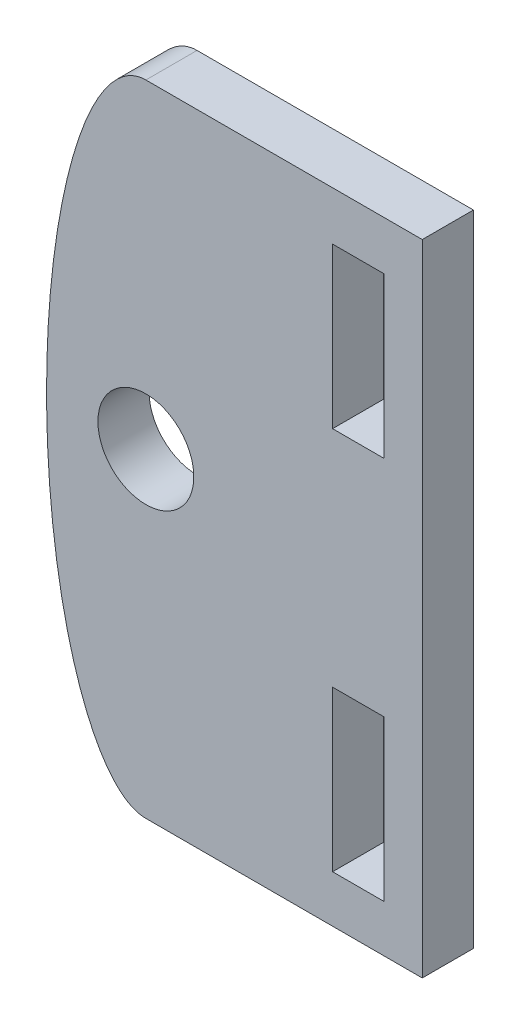
ISO-10303-21;
HEADER;
FILE_DESCRIPTION(('STEP AP214'),'2;1');
FILE_NAME('part.step','',(''),(''),'','','');
FILE_SCHEMA(('AUTOMOTIVE_DESIGN { 1 0 10303 214 1 1 1 1 }'));
ENDSEC;
DATA;
#1=APPLICATION_CONTEXT('core data for automotive mechanical design processes');
#2=APPLICATION_PROTOCOL_DEFINITION('international standard','automotive_design',2000,#1);
#3=PRODUCT_CONTEXT('',#1,'mechanical');
#4=PRODUCT('Part','Part','',(#3));
#5=PRODUCT_RELATED_PRODUCT_CATEGORY('part','',(#4));
#6=PRODUCT_DEFINITION_FORMATION('','',#4);
#7=PRODUCT_DEFINITION_CONTEXT('part definition',#1,'design');
#8=PRODUCT_DEFINITION('design','',#6,#7);
#9=PRODUCT_DEFINITION_SHAPE('','',#8);
#10=(LENGTH_UNIT() NAMED_UNIT(*) SI_UNIT(.MILLI.,.METRE.));
#11=(NAMED_UNIT(*) PLANE_ANGLE_UNIT() SI_UNIT($,.RADIAN.));
#12=(NAMED_UNIT(*) SI_UNIT($,.STERADIAN.) SOLID_ANGLE_UNIT());
#13=UNCERTAINTY_MEASURE_WITH_UNIT(LENGTH_MEASURE(1.E-05),#10,'distance_accuracy_value','');
#14=(GEOMETRIC_REPRESENTATION_CONTEXT(3) GLOBAL_UNCERTAINTY_ASSIGNED_CONTEXT((#13)) GLOBAL_UNIT_ASSIGNED_CONTEXT((#10,
#11,#12)) REPRESENTATION_CONTEXT('',''));
#15=CARTESIAN_POINT('',(0.,0.,0.));
#16=DIRECTION('',(0.,0.,1.));
#17=DIRECTION('',(1.,0.,0.));
#18=AXIS2_PLACEMENT_3D('',#15,#16,#17);
#19=CARTESIAN_POINT('',(149.971351089703,149.795415528333,12.4625));
#20=DIRECTION('',(0.,0.,-1.));
#21=DIRECTION('',(-1.,0.,0.));
#22=AXIS2_PLACEMENT_3D('',#19,#20,#21);
#23=PLANE('',#22);
#24=CARTESIAN_POINT('',(146.460498120251,149.795415528333,12.4625));
#25=DIRECTION('',(0.,0.,1.));
#26=DIRECTION('',(1.,0.,0.));
#27=AXIS2_PLACEMENT_3D('',#24,#25,#26);
#28=CIRCLE('',#27,1.5);
#29=CARTESIAN_POINT('',(144.960498120251,149.795415528333,12.4625));
#30=VERTEX_POINT('',#29);
#31=EDGE_CURVE('E133',#30,#30,#28,.T.);
#32=ORIENTED_EDGE('',*,*,#31,.T.);
#33=EDGE_LOOP('',(#32));
#34=FACE_BOUND('',#33,.T.);
#35=DIRECTION('',(0.,1.,0.));
#36=VECTOR('',#35,1.);
#37=CARTESIAN_POINT('',(153.909014966795,145.532915528333,12.4625));
#38=LINE('',#37,#36);
#39=CARTESIAN_POINT('',(153.909014966795,141.270415528333,12.4625));
#40=VERTEX_POINT('',#39);
#41=CARTESIAN_POINT('',(153.909014966795,146.270415528333,12.4625));
#42=VERTEX_POINT('',#41);
#43=EDGE_CURVE('E159',#40,#42,#38,.T.);
#44=ORIENTED_EDGE('',*,*,#43,.T.);
#45=DIRECTION('',(-1.,0.,0.));
#46=VECTOR('',#45,1.);
#47=CARTESIAN_POINT('',(151.940183028249,146.270415528333,12.4625));
#48=LINE('',#47,#46);
#49=CARTESIAN_POINT('',(152.299014966795,146.270415528333,12.4625));
#50=VERTEX_POINT('',#49);
#51=EDGE_CURVE('E167',#42,#50,#48,.T.);
#52=ORIENTED_EDGE('',*,*,#51,.T.);
#53=DIRECTION('',(0.,-1.,0.));
#54=VECTOR('',#53,1.);
#55=CARTESIAN_POINT('',(152.299014966795,148.032915528333,12.4625));
#56=LINE('',#55,#54);
#57=CARTESIAN_POINT('',(152.299014966795,141.270415528333,12.4625));
#58=VERTEX_POINT('',#57);
#59=EDGE_CURVE('E183',#50,#58,#56,.T.);
#60=ORIENTED_EDGE('',*,*,#59,.T.);
#61=DIRECTION('',(1.,0.,0.));
#62=VECTOR('',#61,1.);
#63=CARTESIAN_POINT('',(151.135183028249,141.270415528333,12.4625));
#64=LINE('',#63,#62);
#65=EDGE_CURVE('E197',#58,#40,#64,.T.);
#66=ORIENTED_EDGE('',*,*,#65,.T.);
#67=EDGE_LOOP('',(#44,#52,#60,#66));
#68=FACE_BOUND('',#67,.T.);
#69=DIRECTION('',(0.,1.,0.));
#70=VECTOR('',#69,1.);
#71=CARTESIAN_POINT('',(153.909014966795,151.532915528333,12.4625));
#72=LINE('',#71,#70);
#73=CARTESIAN_POINT('',(153.909014966795,153.270415528333,12.4625));
#74=VERTEX_POINT('',#73);
#75=CARTESIAN_POINT('',(153.909014966795,158.270415528333,12.4625));
#76=VERTEX_POINT('',#75);
#77=EDGE_CURVE('E250',#74,#76,#72,.T.);
#78=ORIENTED_EDGE('',*,*,#77,.T.);
#79=DIRECTION('',(-1.,0.,0.));
#80=VECTOR('',#79,1.);
#81=CARTESIAN_POINT('',(151.940183028249,158.270415528333,12.4625));
#82=LINE('',#81,#80);
#83=CARTESIAN_POINT('',(152.299014966795,158.270415528333,12.4625));
#84=VERTEX_POINT('',#83);
#85=EDGE_CURVE('E229',#76,#84,#82,.T.);
#86=ORIENTED_EDGE('',*,*,#85,.T.);
#87=DIRECTION('',(0.,-1.,0.));
#88=VECTOR('',#87,1.);
#89=CARTESIAN_POINT('',(152.299014966795,154.032915528333,12.4625));
#90=LINE('',#89,#88);
#91=CARTESIAN_POINT('',(152.299014966795,153.270415528333,12.4625));
#92=VERTEX_POINT('',#91);
#93=EDGE_CURVE('E211',#84,#92,#90,.T.);
#94=ORIENTED_EDGE('',*,*,#93,.T.);
#95=DIRECTION('',(1.,0.,0.));
#96=VECTOR('',#95,1.);
#97=CARTESIAN_POINT('',(151.135183028249,153.270415528333,12.4625));
#98=LINE('',#97,#96);
#99=EDGE_CURVE('E178',#92,#74,#98,.T.);
#100=ORIENTED_EDGE('',*,*,#99,.T.);
#101=EDGE_LOOP('',(#78,#86,#94,#100));
#102=FACE_BOUND('',#101,.T.);
#103=DIRECTION('',(-1.,0.,0.));
#104=VECTOR('',#103,1.);
#105=CARTESIAN_POINT('',(146.460498120251,159.795415528333,12.4625));
#106=LINE('',#105,#104);
#107=CARTESIAN_POINT('',(155.104014966795,159.795415528333,12.4625));
#108=VERTEX_POINT('',#107);
#109=CARTESIAN_POINT('',(146.460498120251,159.795415528333,12.4625));
#110=VERTEX_POINT('',#109);
#111=EDGE_CURVE('E132',#108,#110,#106,.T.);
#112=ORIENTED_EDGE('',*,*,#111,.F.);
#113=DIRECTION('',(0.,1.,0.));
#114=VECTOR('',#113,1.);
#115=CARTESIAN_POINT('',(155.104014966795,159.795415528333,12.4625));
#116=LINE('',#115,#114);
#117=CARTESIAN_POINT('',(155.104014966795,139.795415528333,12.4625));
#118=VERTEX_POINT('',#117);
#119=EDGE_CURVE('E26',#118,#108,#116,.T.);
#120=ORIENTED_EDGE('',*,*,#119,.F.);
#121=DIRECTION('',(1.,0.,0.));
#122=VECTOR('',#121,1.);
#123=CARTESIAN_POINT('',(155.104014966795,139.795415528333,12.4625));
#124=LINE('',#123,#122);
#125=CARTESIAN_POINT('',(146.460498120251,139.795415528333,12.4625));
#126=VERTEX_POINT('',#125);
#127=EDGE_CURVE('E173',#126,#118,#124,.T.);
#128=ORIENTED_EDGE('',*,*,#127,.F.);
#129=CARTESIAN_POINT('',(146.460498120251,149.795415528333,12.4625));
#130=DIRECTION('',(0.,0.,1.));
#131=DIRECTION('',(0.,1.,0.));
#132=AXIS2_PLACEMENT_3D('',#129,#130,#131);
#133=ELLIPSE('',#132,10.,3.10673340497909);
#134=EDGE_CURVE('E149',#110,#126,#133,.T.);
#135=ORIENTED_EDGE('',*,*,#134,.F.);
#136=EDGE_LOOP('',(#112,#120,#128,#135));
#137=FACE_BOUND('',#136,.T.);
#138=ADVANCED_FACE('F16',(#34,#68,#102,#137),#23,.T.);
#139=CARTESIAN_POINT('',(149.971351089703,149.795415528333,14.0625));
#140=DIRECTION('',(0.,0.,-1.));
#141=DIRECTION('',(-1.,0.,0.));
#142=AXIS2_PLACEMENT_3D('',#139,#140,#141);
#143=PLANE('',#142);
#144=CARTESIAN_POINT('',(146.460498120251,149.795415528333,14.0625));
#145=DIRECTION('',(0.,0.,-1.));
#146=DIRECTION('',(1.,0.,0.));
#147=AXIS2_PLACEMENT_3D('',#144,#145,#146);
#148=CIRCLE('',#147,1.5);
#149=CARTESIAN_POINT('',(144.960498120251,149.795415528333,14.0625));
#150=VERTEX_POINT('',#149);
#151=EDGE_CURVE('E127',#150,#150,#148,.T.);
#152=ORIENTED_EDGE('',*,*,#151,.T.);
#153=EDGE_LOOP('',(#152));
#154=FACE_BOUND('',#153,.T.);
#155=DIRECTION('',(0.,-1.,0.));
#156=VECTOR('',#155,1.);
#157=CARTESIAN_POINT('',(153.909014966795,145.532915528333,14.0625));
#158=LINE('',#157,#156);
#159=CARTESIAN_POINT('',(153.909014966795,146.270415528333,14.0625));
#160=VERTEX_POINT('',#159);
#161=CARTESIAN_POINT('',(153.909014966795,141.270415528333,14.0625));
#162=VERTEX_POINT('',#161);
#163=EDGE_CURVE('E158',#160,#162,#158,.T.);
#164=ORIENTED_EDGE('',*,*,#163,.T.);
#165=DIRECTION('',(-1.,0.,0.));
#166=VECTOR('',#165,1.);
#167=CARTESIAN_POINT('',(151.135183028249,141.270415528333,14.0625));
#168=LINE('',#167,#166);
#169=CARTESIAN_POINT('',(152.299014966795,141.270415528333,14.0625));
#170=VERTEX_POINT('',#169);
#171=EDGE_CURVE('E143',#162,#170,#168,.T.);
#172=ORIENTED_EDGE('',*,*,#171,.T.);
#173=DIRECTION('',(0.,1.,0.));
#174=VECTOR('',#173,1.);
#175=CARTESIAN_POINT('',(152.299014966795,148.032915528333,14.0625));
#176=LINE('',#175,#174);
#177=CARTESIAN_POINT('',(152.299014966795,146.270415528333,14.0625));
#178=VERTEX_POINT('',#177);
#179=EDGE_CURVE('E187',#170,#178,#176,.T.);
#180=ORIENTED_EDGE('',*,*,#179,.T.);
#181=DIRECTION('',(1.,0.,0.));
#182=VECTOR('',#181,1.);
#183=CARTESIAN_POINT('',(151.940183028249,146.270415528333,14.0625));
#184=LINE('',#183,#182);
#185=EDGE_CURVE('E164',#178,#160,#184,.T.);
#186=ORIENTED_EDGE('',*,*,#185,.T.);
#187=EDGE_LOOP('',(#164,#172,#180,#186));
#188=FACE_BOUND('',#187,.T.);
#189=DIRECTION('',(0.,-1.,0.));
#190=VECTOR('',#189,1.);
#191=CARTESIAN_POINT('',(153.909014966795,151.532915528333,14.0625));
#192=LINE('',#191,#190);
#193=CARTESIAN_POINT('',(153.909014966795,158.270415528333,14.0625));
#194=VERTEX_POINT('',#193);
#195=CARTESIAN_POINT('',(153.909014966795,153.270415528333,14.0625));
#196=VERTEX_POINT('',#195);
#197=EDGE_CURVE('E191',#194,#196,#192,.T.);
#198=ORIENTED_EDGE('',*,*,#197,.T.);
#199=DIRECTION('',(-1.,0.,0.));
#200=VECTOR('',#199,1.);
#201=CARTESIAN_POINT('',(151.135183028249,153.270415528333,14.0625));
#202=LINE('',#201,#200);
#203=CARTESIAN_POINT('',(152.299014966795,153.270415528333,14.0625));
#204=VERTEX_POINT('',#203);
#205=EDGE_CURVE('E182',#196,#204,#202,.T.);
#206=ORIENTED_EDGE('',*,*,#205,.T.);
#207=DIRECTION('',(0.,1.,0.));
#208=VECTOR('',#207,1.);
#209=CARTESIAN_POINT('',(152.299014966795,154.032915528333,14.0625));
#210=LINE('',#209,#208);
#211=CARTESIAN_POINT('',(152.299014966795,158.270415528333,14.0625));
#212=VERTEX_POINT('',#211);
#213=EDGE_CURVE('E179',#204,#212,#210,.T.);
#214=ORIENTED_EDGE('',*,*,#213,.T.);
#215=DIRECTION('',(1.,0.,0.));
#216=VECTOR('',#215,1.);
#217=CARTESIAN_POINT('',(151.940183028249,158.270415528333,14.0625));
#218=LINE('',#217,#216);
#219=EDGE_CURVE('E212',#212,#194,#218,.T.);
#220=ORIENTED_EDGE('',*,*,#219,.T.);
#221=EDGE_LOOP('',(#198,#206,#214,#220));
#222=FACE_BOUND('',#221,.T.);
#223=DIRECTION('',(0.,-1.,0.));
#224=VECTOR('',#223,1.);
#225=CARTESIAN_POINT('',(155.104014966795,159.795415528333,14.0625));
#226=LINE('',#225,#224);
#227=CARTESIAN_POINT('',(155.104014966795,159.795415528333,14.0625));
#228=VERTEX_POINT('',#227);
#229=CARTESIAN_POINT('',(155.104014966795,139.795415528333,14.0625));
#230=VERTEX_POINT('',#229);
#231=EDGE_CURVE('E10',#228,#230,#226,.T.);
#232=ORIENTED_EDGE('',*,*,#231,.F.);
#233=DIRECTION('',(1.,0.,0.));
#234=VECTOR('',#233,1.);
#235=CARTESIAN_POINT('',(146.460498120251,159.795415528333,14.0625));
#236=LINE('',#235,#234);
#237=CARTESIAN_POINT('',(146.460498120251,159.795415528333,14.0625));
#238=VERTEX_POINT('',#237);
#239=EDGE_CURVE('E163',#238,#228,#236,.T.);
#240=ORIENTED_EDGE('',*,*,#239,.F.);
#241=CARTESIAN_POINT('',(146.460498120251,149.795415528333,14.0625));
#242=DIRECTION('',(0.,0.,-1.));
#243=DIRECTION('',(0.,1.,0.));
#244=AXIS2_PLACEMENT_3D('',#241,#242,#243);
#245=ELLIPSE('',#244,10.,3.10673340497909);
#246=CARTESIAN_POINT('',(146.460498120251,139.795415528333,14.0625));
#247=VERTEX_POINT('',#246);
#248=EDGE_CURVE('E169',#247,#238,#245,.T.);
#249=ORIENTED_EDGE('',*,*,#248,.F.);
#250=DIRECTION('',(-1.,0.,0.));
#251=VECTOR('',#250,1.);
#252=CARTESIAN_POINT('',(155.104014966795,139.795415528333,14.0625));
#253=LINE('',#252,#251);
#254=EDGE_CURVE('E190',#230,#247,#253,.T.);
#255=ORIENTED_EDGE('',*,*,#254,.F.);
#256=EDGE_LOOP('',(#232,#240,#249,#255));
#257=FACE_BOUND('',#256,.T.);
#258=ADVANCED_FACE('F128',(#154,#188,#222,#257),#143,.F.);
#259=CARTESIAN_POINT('',(155.104014966795,139.795415528333,14.0625));
#260=DIRECTION('',(1.,0.,0.));
#261=DIRECTION('',(0.,0.,-1.));
#262=AXIS2_PLACEMENT_3D('',#259,#260,#261);
#263=PLANE('',#262);
#264=ORIENTED_EDGE('',*,*,#119,.T.);
#265=DIRECTION('',(0.,0.,-1.));
#266=VECTOR('',#265,1.);
#267=CARTESIAN_POINT('',(155.104014966795,159.795415528333,14.0625));
#268=LINE('',#267,#266);
#269=EDGE_CURVE('E153',#228,#108,#268,.T.);
#270=ORIENTED_EDGE('',*,*,#269,.F.);
#271=ORIENTED_EDGE('',*,*,#231,.T.);
#272=DIRECTION('',(0.,0.,-1.));
#273=VECTOR('',#272,1.);
#274=CARTESIAN_POINT('',(155.104014966795,139.795415528333,14.0625));
#275=LINE('',#274,#273);
#276=EDGE_CURVE('E216',#230,#118,#275,.T.);
#277=ORIENTED_EDGE('',*,*,#276,.T.);
#278=EDGE_LOOP('',(#264,#270,#271,#277));
#279=FACE_BOUND('',#278,.T.);
#280=ADVANCED_FACE('F356',(#279),#263,.T.);
#281=CARTESIAN_POINT('',(146.460498120251,139.795415528333,14.0625));
#282=DIRECTION('',(0.,-1.,0.));
#283=DIRECTION('',(0.,0.,1.));
#284=AXIS2_PLACEMENT_3D('',#281,#282,#283);
#285=PLANE('',#284);
#286=ORIENTED_EDGE('',*,*,#127,.T.);
#287=ORIENTED_EDGE('',*,*,#276,.F.);
#288=ORIENTED_EDGE('',*,*,#254,.T.);
#289=DIRECTION('',(0.,0.,-1.));
#290=VECTOR('',#289,1.);
#291=CARTESIAN_POINT('',(146.460498120251,139.795415528333,14.0625));
#292=LINE('',#291,#290);
#293=EDGE_CURVE('E146',#247,#126,#292,.T.);
#294=ORIENTED_EDGE('',*,*,#293,.T.);
#295=EDGE_LOOP('',(#286,#287,#288,#294));
#296=FACE_BOUND('',#295,.T.);
#297=ADVANCED_FACE('F567',(#296),#285,.T.);
#298=CARTESIAN_POINT('',(146.460498120251,139.795415528333,14.0625));
#299=CARTESIAN_POINT('',(143.353764715272,139.795415528333,14.0625));
#300=CARTESIAN_POINT('',(143.353764715272,149.795415528333,14.0625));
#301=CARTESIAN_POINT('',(143.353764715272,159.795415528333,14.0625));
#302=CARTESIAN_POINT('',(146.460498120251,159.795415528333,14.0625));
#303=CARTESIAN_POINT('',(146.460498120251,139.795415528333,12.4625));
#304=CARTESIAN_POINT('',(143.353764715272,139.795415528333,12.4625));
#305=CARTESIAN_POINT('',(143.353764715272,149.795415528333,12.4625));
#306=CARTESIAN_POINT('',(143.353764715272,159.795415528333,12.4625));
#307=CARTESIAN_POINT('',(146.460498120251,159.795415528333,12.4625));
#308=(BOUNDED_SURFACE() B_SPLINE_SURFACE(1,2,((#298,#299,#300,#301,#302),(#303,#304,#305,#306,
#307)),.UNSPECIFIED.,.F.,.F.,.F.) B_SPLINE_SURFACE_WITH_KNOTS((2,2),(3,2,3),(0.,0.16),
(-3.1415926535898,-1.5707963267949,0.),
.UNSPECIFIED.) GEOMETRIC_REPRESENTATION_ITEM() RATIONAL_B_SPLINE_SURFACE(((1.,0.707106781186545,
1.,0.707106781186545,1.),(1.,0.707106781186545,1.,0.707106781186545,1.))) REPRESENTATION_ITEM('') SURFACE());
#309=DIRECTION('',(0.,0.,-1.));
#310=VECTOR('',#309,1.);
#311=CARTESIAN_POINT('',(146.460498120251,159.795415528333,14.0625));
#312=LINE('',#311,#310);
#313=EDGE_CURVE('E141',#238,#110,#312,.T.);
#314=ORIENTED_EDGE('',*,*,#134,.T.);
#315=ORIENTED_EDGE('',*,*,#293,.F.);
#316=ORIENTED_EDGE('',*,*,#248,.T.);
#317=ORIENTED_EDGE('',*,*,#313,.T.);
#318=EDGE_LOOP('',(#314,#315,#316,#317));
#319=FACE_BOUND('',#318,.T.);
#320=ADVANCED_FACE('F558',(#319),#308,.F.);
#321=CARTESIAN_POINT('',(155.104014966795,159.795415528333,14.0625));
#322=DIRECTION('',(0.,1.,0.));
#323=DIRECTION('',(-1.,0.,0.));
#324=AXIS2_PLACEMENT_3D('',#321,#322,#323);
#325=PLANE('',#324);
#326=ORIENTED_EDGE('',*,*,#111,.T.);
#327=ORIENTED_EDGE('',*,*,#313,.F.);
#328=ORIENTED_EDGE('',*,*,#239,.T.);
#329=ORIENTED_EDGE('',*,*,#269,.T.);
#330=EDGE_LOOP('',(#326,#327,#328,#329));
#331=FACE_BOUND('',#330,.T.);
#332=ADVANCED_FACE('F550',(#331),#325,.T.);
#333=CARTESIAN_POINT('',(146.460498120251,149.795415528333,14.0625));
#334=DIRECTION('',(0.,0.,-1.));
#335=DIRECTION('',(1.,0.,0.));
#336=AXIS2_PLACEMENT_3D('',#333,#334,#335);
#337=CYLINDRICAL_SURFACE('',#336,1.5);
#338=ORIENTED_EDGE('',*,*,#151,.F.);
#339=EDGE_LOOP('',(#338));
#340=FACE_BOUND('',#339,.T.);
#341=ORIENTED_EDGE('',*,*,#31,.F.);
#342=EDGE_LOOP('',(#341));
#343=FACE_BOUND('',#342,.T.);
#344=ADVANCED_FACE('F540',(#340,#343),#337,.F.);
#345=CARTESIAN_POINT('',(152.299014966795,141.270415528333,14.0625));
#346=DIRECTION('',(0.,-1.,0.));
#347=DIRECTION('',(0.,0.,1.));
#348=AXIS2_PLACEMENT_3D('',#345,#346,#347);
#349=PLANE('',#348);
#350=ORIENTED_EDGE('',*,*,#65,.F.);
#351=DIRECTION('',(0.,0.,-1.));
#352=VECTOR('',#351,1.);
#353=CARTESIAN_POINT('',(152.299014966795,141.270415528333,14.0625));
#354=LINE('',#353,#352);
#355=EDGE_CURVE('E200',#170,#58,#354,.T.);
#356=ORIENTED_EDGE('',*,*,#355,.F.);
#357=ORIENTED_EDGE('',*,*,#171,.F.);
#358=DIRECTION('',(0.,0.,-1.));
#359=VECTOR('',#358,1.);
#360=CARTESIAN_POINT('',(153.909014966795,141.270415528333,14.0625));
#361=LINE('',#360,#359);
#362=EDGE_CURVE('E154',#162,#40,#361,.T.);
#363=ORIENTED_EDGE('',*,*,#362,.T.);
#364=EDGE_LOOP('',(#350,#356,#357,#363));
#365=FACE_BOUND('',#364,.T.);
#366=ADVANCED_FACE('F529',(#365),#349,.F.);
#367=CARTESIAN_POINT('',(152.299014966795,146.270415528333,14.0625));
#368=DIRECTION('',(-1.,0.,0.));
#369=DIRECTION('',(0.,1.,0.));
#370=AXIS2_PLACEMENT_3D('',#367,#368,#369);
#371=PLANE('',#370);
#372=ORIENTED_EDGE('',*,*,#59,.F.);
#373=DIRECTION('',(0.,0.,-1.));
#374=VECTOR('',#373,1.);
#375=CARTESIAN_POINT('',(152.299014966795,146.270415528333,14.0625));
#376=LINE('',#375,#374);
#377=EDGE_CURVE('E166',#178,#50,#376,.T.);
#378=ORIENTED_EDGE('',*,*,#377,.F.);
#379=ORIENTED_EDGE('',*,*,#179,.F.);
#380=ORIENTED_EDGE('',*,*,#355,.T.);
#381=EDGE_LOOP('',(#372,#378,#379,#380));
#382=FACE_BOUND('',#381,.T.);
#383=ADVANCED_FACE('F518',(#382),#371,.F.);
#384=CARTESIAN_POINT('',(153.909014966795,146.270415528333,14.0625));
#385=DIRECTION('',(0.,1.,0.));
#386=DIRECTION('',(-1.,0.,0.));
#387=AXIS2_PLACEMENT_3D('',#384,#385,#386);
#388=PLANE('',#387);
#389=ORIENTED_EDGE('',*,*,#51,.F.);
#390=DIRECTION('',(0.,0.,-1.));
#391=VECTOR('',#390,1.);
#392=CARTESIAN_POINT('',(153.909014966795,146.270415528333,14.0625));
#393=LINE('',#392,#391);
#394=EDGE_CURVE('E19',#160,#42,#393,.T.);
#395=ORIENTED_EDGE('',*,*,#394,.F.);
#396=ORIENTED_EDGE('',*,*,#185,.F.);
#397=ORIENTED_EDGE('',*,*,#377,.T.);
#398=EDGE_LOOP('',(#389,#395,#396,#397));
#399=FACE_BOUND('',#398,.T.);
#400=ADVANCED_FACE('F507',(#399),#388,.F.);
#401=CARTESIAN_POINT('',(153.909014966795,141.270415528333,14.0625));
#402=DIRECTION('',(1.,0.,0.));
#403=DIRECTION('',(0.,0.,-1.));
#404=AXIS2_PLACEMENT_3D('',#401,#402,#403);
#405=PLANE('',#404);
#406=ORIENTED_EDGE('',*,*,#43,.F.);
#407=ORIENTED_EDGE('',*,*,#362,.F.);
#408=ORIENTED_EDGE('',*,*,#163,.F.);
#409=ORIENTED_EDGE('',*,*,#394,.T.);
#410=EDGE_LOOP('',(#406,#407,#408,#409));
#411=FACE_BOUND('',#410,.T.);
#412=ADVANCED_FACE('F364',(#411),#405,.F.);
#413=CARTESIAN_POINT('',(152.299014966795,153.270415528333,14.0625));
#414=DIRECTION('',(0.,-1.,0.));
#415=DIRECTION('',(0.,0.,1.));
#416=AXIS2_PLACEMENT_3D('',#413,#414,#415);
#417=PLANE('',#416);
#418=ORIENTED_EDGE('',*,*,#99,.F.);
#419=DIRECTION('',(0.,0.,-1.));
#420=VECTOR('',#419,1.);
#421=CARTESIAN_POINT('',(152.299014966795,153.270415528333,14.0625));
#422=LINE('',#421,#420);
#423=EDGE_CURVE('E174',#204,#92,#422,.T.);
#424=ORIENTED_EDGE('',*,*,#423,.F.);
#425=ORIENTED_EDGE('',*,*,#205,.F.);
#426=DIRECTION('',(0.,0.,-1.));
#427=VECTOR('',#426,1.);
#428=CARTESIAN_POINT('',(153.909014966795,153.270415528333,14.0625));
#429=LINE('',#428,#427);
#430=EDGE_CURVE('E196',#196,#74,#429,.T.);
#431=ORIENTED_EDGE('',*,*,#430,.T.);
#432=EDGE_LOOP('',(#418,#424,#425,#431));
#433=FACE_BOUND('',#432,.T.);
#434=ADVANCED_FACE('F267',(#433),#417,.F.);
#435=CARTESIAN_POINT('',(152.299014966795,158.270415528333,14.0625));
#436=DIRECTION('',(-1.,0.,0.));
#437=DIRECTION('',(0.,1.,0.));
#438=AXIS2_PLACEMENT_3D('',#435,#436,#437);
#439=PLANE('',#438);
#440=ORIENTED_EDGE('',*,*,#93,.F.);
#441=DIRECTION('',(0.,0.,-1.));
#442=VECTOR('',#441,1.);
#443=CARTESIAN_POINT('',(152.299014966795,158.270415528333,14.0625));
#444=LINE('',#443,#442);
#445=EDGE_CURVE('E207',#212,#84,#444,.T.);
#446=ORIENTED_EDGE('',*,*,#445,.F.);
#447=ORIENTED_EDGE('',*,*,#213,.F.);
#448=ORIENTED_EDGE('',*,*,#423,.T.);
#449=EDGE_LOOP('',(#440,#446,#447,#448));
#450=FACE_BOUND('',#449,.T.);
#451=ADVANCED_FACE('F287',(#450),#439,.F.);
#452=CARTESIAN_POINT('',(153.909014966795,158.270415528333,14.0625));
#453=DIRECTION('',(0.,1.,0.));
#454=DIRECTION('',(-1.,0.,0.));
#455=AXIS2_PLACEMENT_3D('',#452,#453,#454);
#456=PLANE('',#455);
#457=ORIENTED_EDGE('',*,*,#85,.F.);
#458=DIRECTION('',(0.,0.,-1.));
#459=VECTOR('',#458,1.);
#460=CARTESIAN_POINT('',(153.909014966795,158.270415528333,14.0625));
#461=LINE('',#460,#459);
#462=EDGE_CURVE('E195',#194,#76,#461,.T.);
#463=ORIENTED_EDGE('',*,*,#462,.F.);
#464=ORIENTED_EDGE('',*,*,#219,.F.);
#465=ORIENTED_EDGE('',*,*,#445,.T.);
#466=EDGE_LOOP('',(#457,#463,#464,#465));
#467=FACE_BOUND('',#466,.T.);
#468=ADVANCED_FACE('F289',(#467),#456,.F.);
#469=CARTESIAN_POINT('',(153.909014966795,153.270415528333,14.0625));
#470=DIRECTION('',(1.,0.,0.));
#471=DIRECTION('',(0.,0.,-1.));
#472=AXIS2_PLACEMENT_3D('',#469,#470,#471);
#473=PLANE('',#472);
#474=ORIENTED_EDGE('',*,*,#77,.F.);
#475=ORIENTED_EDGE('',*,*,#430,.F.);
#476=ORIENTED_EDGE('',*,*,#197,.F.);
#477=ORIENTED_EDGE('',*,*,#462,.T.);
#478=EDGE_LOOP('',(#474,#475,#476,#477));
#479=FACE_BOUND('',#478,.T.);
#480=ADVANCED_FACE('F271',(#479),#473,.F.);
#481=CLOSED_SHELL('',(#138,#258,#280,#297,#320,#332,#344,#366,#383,#400,#412,#434,#451,#468,#480));
#482=MANIFOLD_SOLID_BREP('B1',#481);
#483=ADVANCED_BREP_SHAPE_REPRESENTATION('',(#18,#482),#14);
#484=SHAPE_DEFINITION_REPRESENTATION(#9,#483);
ENDSEC;
END-ISO-10303-21;
